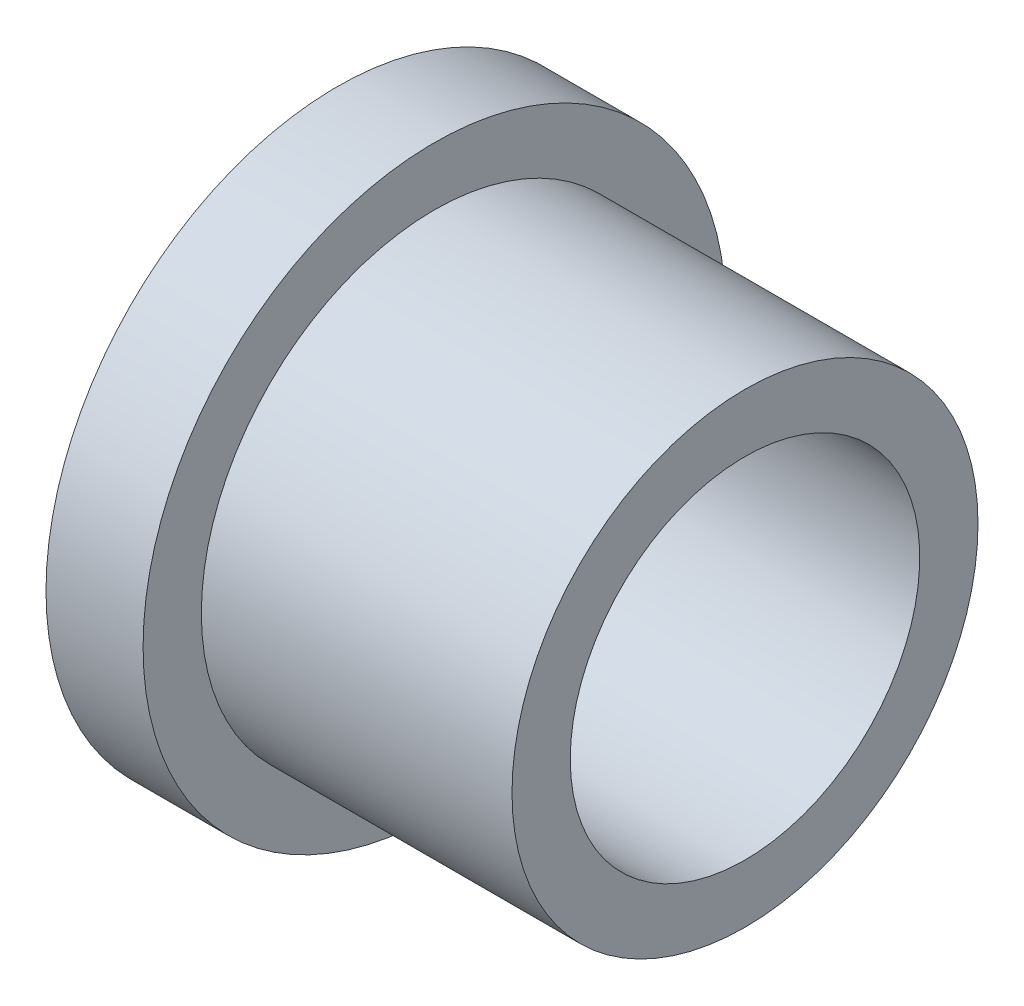
ISO-10303-21;
HEADER;
FILE_DESCRIPTION(('STEP AP214'),'2;1');
FILE_NAME('part.step','',(''),(''),'','','');
FILE_SCHEMA(('AUTOMOTIVE_DESIGN { 1 0 10303 214 1 1 1 1 }'));
ENDSEC;
DATA;
#1=APPLICATION_CONTEXT('core data for automotive mechanical design processes');
#2=APPLICATION_PROTOCOL_DEFINITION('international standard','automotive_design',2000,#1);
#3=PRODUCT_CONTEXT('',#1,'mechanical');
#4=PRODUCT('Part','Part','',(#3));
#5=PRODUCT_RELATED_PRODUCT_CATEGORY('part','',(#4));
#6=PRODUCT_DEFINITION_FORMATION('','',#4);
#7=PRODUCT_DEFINITION_CONTEXT('part definition',#1,'design');
#8=PRODUCT_DEFINITION('design','',#6,#7);
#9=PRODUCT_DEFINITION_SHAPE('','',#8);
#10=(LENGTH_UNIT() NAMED_UNIT(*) SI_UNIT(.MILLI.,.METRE.));
#11=(NAMED_UNIT(*) PLANE_ANGLE_UNIT() SI_UNIT($,.RADIAN.));
#12=(NAMED_UNIT(*) SI_UNIT($,.STERADIAN.) SOLID_ANGLE_UNIT());
#13=UNCERTAINTY_MEASURE_WITH_UNIT(LENGTH_MEASURE(1.E-05),#10,'distance_accuracy_value','');
#14=(GEOMETRIC_REPRESENTATION_CONTEXT(3) GLOBAL_UNCERTAINTY_ASSIGNED_CONTEXT((#13)) GLOBAL_UNIT_ASSIGNED_CONTEXT((#10,
#11,#12)) REPRESENTATION_CONTEXT('',''));
#15=CARTESIAN_POINT('',(0.,0.,0.));
#16=DIRECTION('',(0.,0.,1.));
#17=DIRECTION('',(1.,0.,0.));
#18=AXIS2_PLACEMENT_3D('',#15,#16,#17);
#19=CARTESIAN_POINT('',(-10.5,0.,0.));
#20=DIRECTION('',(-1.,0.,0.));
#21=DIRECTION('',(0.,0.,1.));
#22=AXIS2_PLACEMENT_3D('',#19,#20,#21);
#23=PLANE('',#22);
#24=CARTESIAN_POINT('',(-10.5,0.,0.));
#25=DIRECTION('',(-1.,0.,0.));
#26=DIRECTION('',(0.,0.,1.));
#27=AXIS2_PLACEMENT_3D('',#24,#25,#26);
#28=CIRCLE('',#27,15.);
#29=CARTESIAN_POINT('',(-10.5,0.,15.));
#30=VERTEX_POINT('',#29);
#31=EDGE_CURVE('E58',#30,#30,#28,.T.);
#32=ORIENTED_EDGE('',*,*,#31,.T.);
#33=EDGE_LOOP('',(#32));
#34=FACE_BOUND('',#33,.T.);
#35=CARTESIAN_POINT('',(-10.5,0.,0.));
#36=DIRECTION('',(-1.,0.,0.));
#37=DIRECTION('',(0.,0.,1.));
#38=AXIS2_PLACEMENT_3D('',#35,#36,#37);
#39=CIRCLE('',#38,9.);
#40=CARTESIAN_POINT('',(-10.5,0.,9.));
#41=VERTEX_POINT('',#40);
#42=EDGE_CURVE('E10',#41,#41,#39,.T.);
#43=ORIENTED_EDGE('',*,*,#42,.F.);
#44=EDGE_LOOP('',(#43));
#45=FACE_BOUND('',#44,.T.);
#46=ADVANCED_FACE('F36',(#34,#45),#23,.T.);
#47=CARTESIAN_POINT('',(-10.5,0.,0.));
#48=DIRECTION('',(-1.,0.,0.));
#49=DIRECTION('',(0.,0.,1.));
#50=AXIS2_PLACEMENT_3D('',#47,#48,#49);
#51=CYLINDRICAL_SURFACE('',#50,9.);
#52=CARTESIAN_POINT('',(10.5,0.,0.));
#53=DIRECTION('',(-1.,0.,0.));
#54=DIRECTION('',(0.,0.,1.));
#55=AXIS2_PLACEMENT_3D('',#52,#53,#54);
#56=CIRCLE('',#55,9.);
#57=CARTESIAN_POINT('',(10.5,0.,9.));
#58=VERTEX_POINT('',#57);
#59=EDGE_CURVE('E42',#58,#58,#56,.T.);
#60=ORIENTED_EDGE('',*,*,#59,.F.);
#61=EDGE_LOOP('',(#60));
#62=FACE_BOUND('',#61,.T.);
#63=ORIENTED_EDGE('',*,*,#42,.T.);
#64=EDGE_LOOP('',(#63));
#65=FACE_BOUND('',#64,.T.);
#66=ADVANCED_FACE('F76',(#62,#65),#51,.F.);
#67=CARTESIAN_POINT('',(10.5,0.,0.));
#68=DIRECTION('',(1.,0.,0.));
#69=DIRECTION('',(0.,0.,-1.));
#70=AXIS2_PLACEMENT_3D('',#67,#68,#69);
#71=PLANE('',#70);
#72=ORIENTED_EDGE('',*,*,#59,.T.);
#73=EDGE_LOOP('',(#72));
#74=FACE_BOUND('',#73,.T.);
#75=CARTESIAN_POINT('',(10.5,0.,0.));
#76=DIRECTION('',(-1.,0.,0.));
#77=DIRECTION('',(0.,0.,1.));
#78=AXIS2_PLACEMENT_3D('',#75,#76,#77);
#79=CIRCLE('',#78,12.);
#80=CARTESIAN_POINT('',(10.5,0.,12.));
#81=VERTEX_POINT('',#80);
#82=EDGE_CURVE('E46',#81,#81,#79,.T.);
#83=ORIENTED_EDGE('',*,*,#82,.F.);
#84=EDGE_LOOP('',(#83));
#85=FACE_BOUND('',#84,.T.);
#86=ADVANCED_FACE('F80',(#74,#85),#71,.T.);
#87=CARTESIAN_POINT('',(-10.5,0.,0.));
#88=DIRECTION('',(-1.,0.,0.));
#89=DIRECTION('',(0.,0.,1.));
#90=AXIS2_PLACEMENT_3D('',#87,#88,#89);
#91=CYLINDRICAL_SURFACE('',#90,12.);
#92=ORIENTED_EDGE('',*,*,#82,.T.);
#93=EDGE_LOOP('',(#92));
#94=FACE_BOUND('',#93,.T.);
#95=CARTESIAN_POINT('',(-5.50000000000001,0.,0.));
#96=DIRECTION('',(-1.,0.,0.));
#97=DIRECTION('',(0.,0.,1.));
#98=AXIS2_PLACEMENT_3D('',#95,#96,#97);
#99=CIRCLE('',#98,12.);
#100=CARTESIAN_POINT('',(-5.50000000000001,0.,12.));
#101=VERTEX_POINT('',#100);
#102=EDGE_CURVE('E50',#101,#101,#99,.T.);
#103=ORIENTED_EDGE('',*,*,#102,.F.);
#104=EDGE_LOOP('',(#103));
#105=FACE_BOUND('',#104,.T.);
#106=ADVANCED_FACE('F72',(#94,#105),#91,.T.);
#107=CARTESIAN_POINT('',(-5.50000000000001,0.,0.));
#108=DIRECTION('',(-1.,0.,0.));
#109=DIRECTION('',(0.,0.,1.));
#110=AXIS2_PLACEMENT_3D('',#107,#108,#109);
#111=PLANE('',#110);
#112=CARTESIAN_POINT('',(-5.50000000000001,0.,0.));
#113=DIRECTION('',(-1.,0.,0.));
#114=DIRECTION('',(0.,0.,1.));
#115=AXIS2_PLACEMENT_3D('',#112,#113,#114);
#116=CIRCLE('',#115,15.);
#117=CARTESIAN_POINT('',(-5.50000000000001,0.,15.));
#118=VERTEX_POINT('',#117);
#119=EDGE_CURVE('E55',#118,#118,#116,.T.);
#120=ORIENTED_EDGE('',*,*,#119,.F.);
#121=EDGE_LOOP('',(#120));
#122=FACE_BOUND('',#121,.T.);
#123=ORIENTED_EDGE('',*,*,#102,.T.);
#124=EDGE_LOOP('',(#123));
#125=FACE_BOUND('',#124,.T.);
#126=ADVANCED_FACE('F66',(#122,#125),#111,.F.);
#127=CARTESIAN_POINT('',(-10.5,0.,0.));
#128=DIRECTION('',(-1.,0.,0.));
#129=DIRECTION('',(0.,0.,1.));
#130=AXIS2_PLACEMENT_3D('',#127,#128,#129);
#131=CYLINDRICAL_SURFACE('',#130,15.);
#132=ORIENTED_EDGE('',*,*,#119,.T.);
#133=EDGE_LOOP('',(#132));
#134=FACE_BOUND('',#133,.T.);
#135=ORIENTED_EDGE('',*,*,#31,.F.);
#136=EDGE_LOOP('',(#135));
#137=FACE_BOUND('',#136,.T.);
#138=ADVANCED_FACE('F64',(#134,#137),#131,.T.);
#139=CLOSED_SHELL('',(#46,#66,#86,#106,#126,#138));
#140=MANIFOLD_SOLID_BREP('B2',#139);
#141=ADVANCED_BREP_SHAPE_REPRESENTATION('',(#18,#140),#14);
#142=SHAPE_DEFINITION_REPRESENTATION(#9,#141);
ENDSEC;
END-ISO-10303-21;
